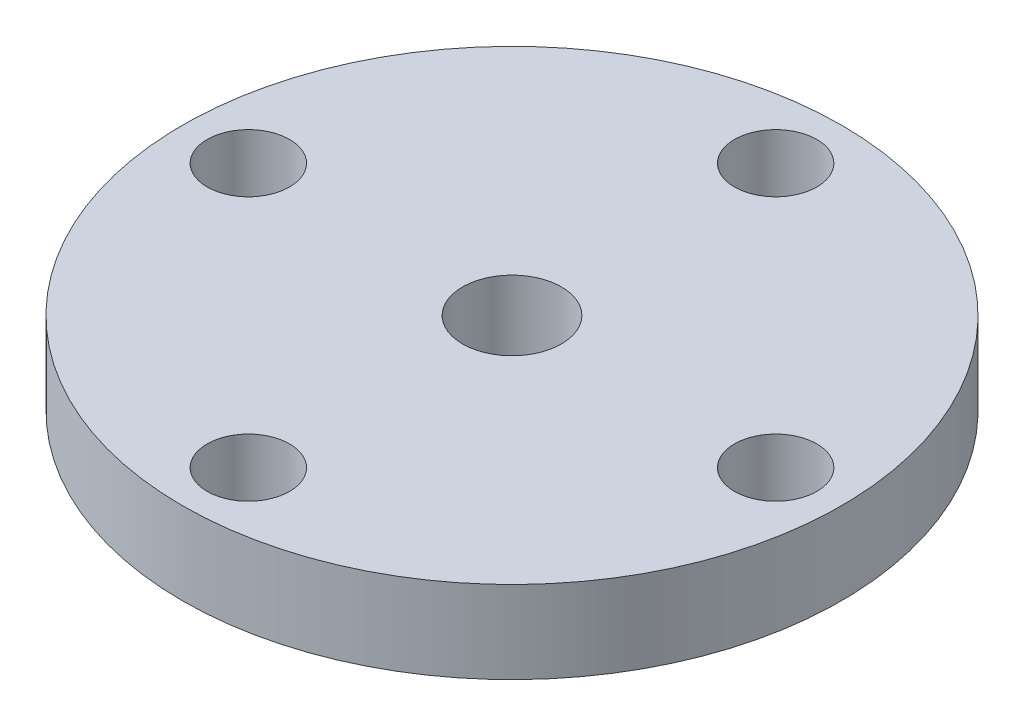
ISO-10303-21;
HEADER;
FILE_DESCRIPTION(('STEP AP214'),'2;1');
FILE_NAME('part.step','',(''),(''),'','','');
FILE_SCHEMA(('AUTOMOTIVE_DESIGN { 1 0 10303 214 1 1 1 1 }'));
ENDSEC;
DATA;
#1=APPLICATION_CONTEXT('core data for automotive mechanical design processes');
#2=APPLICATION_PROTOCOL_DEFINITION('international standard','automotive_design',2000,#1);
#3=PRODUCT_CONTEXT('',#1,'mechanical');
#4=PRODUCT('Part','Part','',(#3));
#5=PRODUCT_RELATED_PRODUCT_CATEGORY('part','',(#4));
#6=PRODUCT_DEFINITION_FORMATION('','',#4);
#7=PRODUCT_DEFINITION_CONTEXT('part definition',#1,'design');
#8=PRODUCT_DEFINITION('design','',#6,#7);
#9=PRODUCT_DEFINITION_SHAPE('','',#8);
#10=(LENGTH_UNIT() NAMED_UNIT(*) SI_UNIT(.MILLI.,.METRE.));
#11=(NAMED_UNIT(*) PLANE_ANGLE_UNIT() SI_UNIT($,.RADIAN.));
#12=(NAMED_UNIT(*) SI_UNIT($,.STERADIAN.) SOLID_ANGLE_UNIT());
#13=UNCERTAINTY_MEASURE_WITH_UNIT(LENGTH_MEASURE(1.E-05),#10,'distance_accuracy_value','');
#14=(GEOMETRIC_REPRESENTATION_CONTEXT(3) GLOBAL_UNCERTAINTY_ASSIGNED_CONTEXT((#13)) GLOBAL_UNIT_ASSIGNED_CONTEXT((#10,
#11,#12)) REPRESENTATION_CONTEXT('',''));
#15=CARTESIAN_POINT('',(0.,0.,0.));
#16=DIRECTION('',(0.,0.,1.));
#17=DIRECTION('',(1.,0.,0.));
#18=AXIS2_PLACEMENT_3D('',#15,#16,#17);
#19=CARTESIAN_POINT('',(0.,2.5,0.));
#20=DIRECTION('',(0.,-1.,0.));
#21=DIRECTION('',(0.,0.,-1.));
#22=AXIS2_PLACEMENT_3D('',#19,#20,#21);
#23=CYLINDRICAL_SURFACE('',#22,1.5);
#24=CARTESIAN_POINT('',(0.,2.5,0.));
#25=DIRECTION('',(0.,1.,0.));
#26=DIRECTION('',(0.,0.,1.));
#27=AXIS2_PLACEMENT_3D('',#24,#25,#26);
#28=CIRCLE('',#27,1.5);
#29=CARTESIAN_POINT('',(0.,2.5,1.5));
#30=VERTEX_POINT('',#29);
#31=EDGE_CURVE('E45',#30,#30,#28,.T.);
#32=ORIENTED_EDGE('',*,*,#31,.T.);
#33=EDGE_LOOP('',(#32));
#34=FACE_BOUND('',#33,.T.);
#35=CARTESIAN_POINT('',(0.,0.,0.));
#36=DIRECTION('',(0.,1.,0.));
#37=DIRECTION('',(0.,0.,1.));
#38=AXIS2_PLACEMENT_3D('',#35,#36,#37);
#39=CIRCLE('',#38,1.5);
#40=CARTESIAN_POINT('',(0.,0.,1.5));
#41=VERTEX_POINT('',#40);
#42=EDGE_CURVE('E65',#41,#41,#39,.T.);
#43=ORIENTED_EDGE('',*,*,#42,.F.);
#44=EDGE_LOOP('',(#43));
#45=FACE_BOUND('',#44,.T.);
#46=ADVANCED_FACE('F37',(#34,#45),#23,.F.);
#47=CARTESIAN_POINT('',(0.,2.5,-8.));
#48=DIRECTION('',(0.,-1.,0.));
#49=DIRECTION('',(0.,0.,-1.));
#50=AXIS2_PLACEMENT_3D('',#47,#48,#49);
#51=CYLINDRICAL_SURFACE('',#50,1.25);
#52=CARTESIAN_POINT('',(0.,2.5,-8.));
#53=DIRECTION('',(0.,1.,0.));
#54=DIRECTION('',(0.,0.,1.));
#55=AXIS2_PLACEMENT_3D('',#52,#53,#54);
#56=CIRCLE('',#55,1.25);
#57=CARTESIAN_POINT('',(0.,2.5,-6.75));
#58=VERTEX_POINT('',#57);
#59=EDGE_CURVE('E50',#58,#58,#56,.T.);
#60=ORIENTED_EDGE('',*,*,#59,.T.);
#61=EDGE_LOOP('',(#60));
#62=FACE_BOUND('',#61,.T.);
#63=CARTESIAN_POINT('',(0.,0.,-8.));
#64=DIRECTION('',(0.,1.,0.));
#65=DIRECTION('',(0.,0.,1.));
#66=AXIS2_PLACEMENT_3D('',#63,#64,#65);
#67=CIRCLE('',#66,1.25);
#68=CARTESIAN_POINT('',(0.,0.,-6.75));
#69=VERTEX_POINT('',#68);
#70=EDGE_CURVE('E63',#69,#69,#67,.T.);
#71=ORIENTED_EDGE('',*,*,#70,.F.);
#72=EDGE_LOOP('',(#71));
#73=FACE_BOUND('',#72,.T.);
#74=ADVANCED_FACE('F86',(#62,#73),#51,.F.);
#75=CARTESIAN_POINT('',(8.,2.5,0.));
#76=DIRECTION('',(0.,-1.,0.));
#77=DIRECTION('',(0.,0.,-1.));
#78=AXIS2_PLACEMENT_3D('',#75,#76,#77);
#79=CYLINDRICAL_SURFACE('',#78,1.25);
#80=CARTESIAN_POINT('',(8.,2.5,0.));
#81=DIRECTION('',(0.,1.,0.));
#82=DIRECTION('',(0.,0.,1.));
#83=AXIS2_PLACEMENT_3D('',#80,#81,#82);
#84=CIRCLE('',#83,1.25);
#85=CARTESIAN_POINT('',(8.,2.5,1.25));
#86=VERTEX_POINT('',#85);
#87=EDGE_CURVE('E79',#86,#86,#84,.T.);
#88=ORIENTED_EDGE('',*,*,#87,.T.);
#89=EDGE_LOOP('',(#88));
#90=FACE_BOUND('',#89,.T.);
#91=CARTESIAN_POINT('',(8.,0.,0.));
#92=DIRECTION('',(0.,1.,0.));
#93=DIRECTION('',(0.,0.,1.));
#94=AXIS2_PLACEMENT_3D('',#91,#92,#93);
#95=CIRCLE('',#94,1.25);
#96=CARTESIAN_POINT('',(8.,0.,1.25));
#97=VERTEX_POINT('',#96);
#98=EDGE_CURVE('E60',#97,#97,#95,.T.);
#99=ORIENTED_EDGE('',*,*,#98,.F.);
#100=EDGE_LOOP('',(#99));
#101=FACE_BOUND('',#100,.T.);
#102=ADVANCED_FACE('F104',(#90,#101),#79,.F.);
#103=CARTESIAN_POINT('',(0.,2.5,8.));
#104=DIRECTION('',(0.,-1.,0.));
#105=DIRECTION('',(0.,0.,-1.));
#106=AXIS2_PLACEMENT_3D('',#103,#104,#105);
#107=CYLINDRICAL_SURFACE('',#106,1.25);
#108=CARTESIAN_POINT('',(0.,2.5,8.));
#109=DIRECTION('',(0.,1.,0.));
#110=DIRECTION('',(0.,0.,1.));
#111=AXIS2_PLACEMENT_3D('',#108,#109,#110);
#112=CIRCLE('',#111,1.25);
#113=CARTESIAN_POINT('',(0.,2.5,9.25));
#114=VERTEX_POINT('',#113);
#115=EDGE_CURVE('E74',#114,#114,#112,.T.);
#116=ORIENTED_EDGE('',*,*,#115,.T.);
#117=EDGE_LOOP('',(#116));
#118=FACE_BOUND('',#117,.T.);
#119=CARTESIAN_POINT('',(0.,0.,8.));
#120=DIRECTION('',(0.,1.,0.));
#121=DIRECTION('',(0.,0.,1.));
#122=AXIS2_PLACEMENT_3D('',#119,#120,#121);
#123=CIRCLE('',#122,1.25);
#124=CARTESIAN_POINT('',(0.,0.,9.25));
#125=VERTEX_POINT('',#124);
#126=EDGE_CURVE('E57',#125,#125,#123,.T.);
#127=ORIENTED_EDGE('',*,*,#126,.F.);
#128=EDGE_LOOP('',(#127));
#129=FACE_BOUND('',#128,.T.);
#130=ADVANCED_FACE('F110',(#118,#129),#107,.F.);
#131=CARTESIAN_POINT('',(-8.,2.5,0.));
#132=DIRECTION('',(0.,-1.,0.));
#133=DIRECTION('',(0.,0.,-1.));
#134=AXIS2_PLACEMENT_3D('',#131,#132,#133);
#135=CYLINDRICAL_SURFACE('',#134,1.25);
#136=CARTESIAN_POINT('',(-8.,2.5,0.));
#137=DIRECTION('',(0.,1.,0.));
#138=DIRECTION('',(0.,0.,1.));
#139=AXIS2_PLACEMENT_3D('',#136,#137,#138);
#140=CIRCLE('',#139,1.25);
#141=CARTESIAN_POINT('',(-8.,2.5,1.25));
#142=VERTEX_POINT('',#141);
#143=EDGE_CURVE('E70',#142,#142,#140,.T.);
#144=ORIENTED_EDGE('',*,*,#143,.T.);
#145=EDGE_LOOP('',(#144));
#146=FACE_BOUND('',#145,.T.);
#147=CARTESIAN_POINT('',(-8.,0.,0.));
#148=DIRECTION('',(0.,1.,0.));
#149=DIRECTION('',(0.,0.,1.));
#150=AXIS2_PLACEMENT_3D('',#147,#148,#149);
#151=CIRCLE('',#150,1.25);
#152=CARTESIAN_POINT('',(-8.,0.,1.25));
#153=VERTEX_POINT('',#152);
#154=EDGE_CURVE('E54',#153,#153,#151,.T.);
#155=ORIENTED_EDGE('',*,*,#154,.F.);
#156=EDGE_LOOP('',(#155));
#157=FACE_BOUND('',#156,.T.);
#158=ADVANCED_FACE('F39',(#146,#157),#135,.F.);
#159=CARTESIAN_POINT('',(0.,2.5,0.));
#160=DIRECTION('',(0.,-1.,0.));
#161=DIRECTION('',(0.,0.,-1.));
#162=AXIS2_PLACEMENT_3D('',#159,#160,#161);
#163=CYLINDRICAL_SURFACE('',#162,10.);
#164=CARTESIAN_POINT('',(0.,2.5,0.));
#165=DIRECTION('',(0.,1.,0.));
#166=DIRECTION('',(0.,0.,1.));
#167=AXIS2_PLACEMENT_3D('',#164,#165,#166);
#168=CIRCLE('',#167,10.);
#169=CARTESIAN_POINT('',(0.,2.5,10.));
#170=VERTEX_POINT('',#169);
#171=EDGE_CURVE('E10',#170,#170,#168,.T.);
#172=ORIENTED_EDGE('',*,*,#171,.F.);
#173=EDGE_LOOP('',(#172));
#174=FACE_BOUND('',#173,.T.);
#175=CARTESIAN_POINT('',(0.,0.,0.));
#176=DIRECTION('',(0.,1.,0.));
#177=DIRECTION('',(0.,0.,1.));
#178=AXIS2_PLACEMENT_3D('',#175,#176,#177);
#179=CIRCLE('',#178,10.);
#180=CARTESIAN_POINT('',(0.,0.,10.));
#181=VERTEX_POINT('',#180);
#182=EDGE_CURVE('E41',#181,#181,#179,.T.);
#183=ORIENTED_EDGE('',*,*,#182,.T.);
#184=EDGE_LOOP('',(#183));
#185=FACE_BOUND('',#184,.T.);
#186=ADVANCED_FACE('F93',(#174,#185),#163,.T.);
#187=CARTESIAN_POINT('',(0.,2.5,0.));
#188=DIRECTION('',(0.,1.,0.));
#189=DIRECTION('',(0.,0.,1.));
#190=AXIS2_PLACEMENT_3D('',#187,#188,#189);
#191=PLANE('',#190);
#192=ORIENTED_EDGE('',*,*,#143,.F.);
#193=EDGE_LOOP('',(#192));
#194=FACE_BOUND('',#193,.T.);
#195=ORIENTED_EDGE('',*,*,#115,.F.);
#196=EDGE_LOOP('',(#195));
#197=FACE_BOUND('',#196,.T.);
#198=ORIENTED_EDGE('',*,*,#87,.F.);
#199=EDGE_LOOP('',(#198));
#200=FACE_BOUND('',#199,.T.);
#201=ORIENTED_EDGE('',*,*,#59,.F.);
#202=EDGE_LOOP('',(#201));
#203=FACE_BOUND('',#202,.T.);
#204=ORIENTED_EDGE('',*,*,#31,.F.);
#205=EDGE_LOOP('',(#204));
#206=FACE_BOUND('',#205,.T.);
#207=ORIENTED_EDGE('',*,*,#171,.T.);
#208=EDGE_LOOP('',(#207));
#209=FACE_BOUND('',#208,.T.);
#210=ADVANCED_FACE('F89',(#194,#197,#200,#203,#206,#209),#191,.T.);
#211=CARTESIAN_POINT('',(0.,0.,0.));
#212=DIRECTION('',(0.,1.,0.));
#213=DIRECTION('',(0.,0.,1.));
#214=AXIS2_PLACEMENT_3D('',#211,#212,#213);
#215=PLANE('',#214);
#216=ORIENTED_EDGE('',*,*,#154,.T.);
#217=EDGE_LOOP('',(#216));
#218=FACE_BOUND('',#217,.T.);
#219=ORIENTED_EDGE('',*,*,#126,.T.);
#220=EDGE_LOOP('',(#219));
#221=FACE_BOUND('',#220,.T.);
#222=ORIENTED_EDGE('',*,*,#98,.T.);
#223=EDGE_LOOP('',(#222));
#224=FACE_BOUND('',#223,.T.);
#225=ORIENTED_EDGE('',*,*,#70,.T.);
#226=EDGE_LOOP('',(#225));
#227=FACE_BOUND('',#226,.T.);
#228=ORIENTED_EDGE('',*,*,#42,.T.);
#229=EDGE_LOOP('',(#228));
#230=FACE_BOUND('',#229,.T.);
#231=ORIENTED_EDGE('',*,*,#182,.F.);
#232=EDGE_LOOP('',(#231));
#233=FACE_BOUND('',#232,.T.);
#234=ADVANCED_FACE('F92',(#218,#221,#224,#227,#230,#233),#215,.F.);
#235=CLOSED_SHELL('',(#46,#74,#102,#130,#158,#186,#210,#234));
#236=MANIFOLD_SOLID_BREP('B2',#235);
#237=ADVANCED_BREP_SHAPE_REPRESENTATION('',(#18,#236),#14);
#238=SHAPE_DEFINITION_REPRESENTATION(#9,#237);
ENDSEC;
END-ISO-10303-21;
